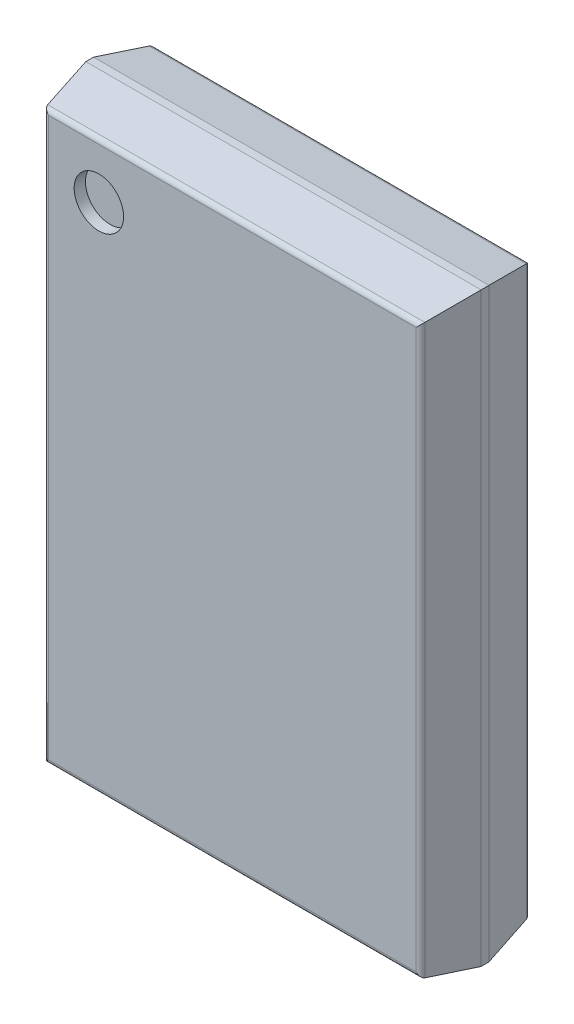
ISO-10303-21;
HEADER;
FILE_DESCRIPTION(('STEP AP214'),'2;1');
FILE_NAME('part.step','',(''),(''),'','','');
FILE_SCHEMA(('AUTOMOTIVE_DESIGN { 1 0 10303 214 1 1 1 1 }'));
ENDSEC;
DATA;
#1=APPLICATION_CONTEXT('core data for automotive mechanical design processes');
#2=APPLICATION_PROTOCOL_DEFINITION('international standard','automotive_design',2000,#1);
#3=PRODUCT_CONTEXT('',#1,'mechanical');
#4=PRODUCT('Part','Part','',(#3));
#5=PRODUCT_RELATED_PRODUCT_CATEGORY('part','',(#4));
#6=PRODUCT_DEFINITION_FORMATION('','',#4);
#7=PRODUCT_DEFINITION_CONTEXT('part definition',#1,'design');
#8=PRODUCT_DEFINITION('design','',#6,#7);
#9=PRODUCT_DEFINITION_SHAPE('','',#8);
#10=(LENGTH_UNIT() NAMED_UNIT(*) SI_UNIT(.MILLI.,.METRE.));
#11=(NAMED_UNIT(*) PLANE_ANGLE_UNIT() SI_UNIT($,.RADIAN.));
#12=(NAMED_UNIT(*) SI_UNIT($,.STERADIAN.) SOLID_ANGLE_UNIT());
#13=UNCERTAINTY_MEASURE_WITH_UNIT(LENGTH_MEASURE(1.E-05),#10,'distance_accuracy_value','');
#14=(GEOMETRIC_REPRESENTATION_CONTEXT(3) GLOBAL_UNCERTAINTY_ASSIGNED_CONTEXT((#13)) GLOBAL_UNIT_ASSIGNED_CONTEXT((#10,
#11,#12)) REPRESENTATION_CONTEXT('',''));
#15=CARTESIAN_POINT('',(0.,0.,0.));
#16=DIRECTION('',(0.,0.,1.));
#17=DIRECTION('',(1.,0.,0.));
#18=AXIS2_PLACEMENT_3D('',#15,#16,#17);
#19=CARTESIAN_POINT('',(-1.89,3.24,1.44));
#20=DIRECTION('',(0.,0.,1.));
#21=DIRECTION('',(1.,0.,0.));
#22=AXIS2_PLACEMENT_3D('',#19,#20,#21);
#23=PLANE('',#22);
#24=CARTESIAN_POINT('',(-1.89,3.24,1.44));
#25=DIRECTION('',(0.,0.,1.));
#26=DIRECTION('',(1.,0.,0.));
#27=AXIS2_PLACEMENT_3D('',#24,#25,#26);
#28=CIRCLE('',#27,0.35);
#29=CARTESIAN_POINT('',(-1.54,3.24,1.44));
#30=VERTEX_POINT('',#29);
#31=EDGE_CURVE('E20',#30,#30,#28,.T.);
#32=ORIENTED_EDGE('',*,*,#31,.T.);
#33=EDGE_LOOP('',(#32));
#34=FACE_BOUND('',#33,.T.);
#35=ADVANCED_FACE('F17',(#34),#23,.T.);
#36=CARTESIAN_POINT('',(-1.89,3.24,1.44));
#37=DIRECTION('',(0.,0.,1.));
#38=DIRECTION('',(1.,0.,0.));
#39=AXIS2_PLACEMENT_3D('',#36,#37,#38);
#40=CYLINDRICAL_SURFACE('',#39,0.35);
#41=CARTESIAN_POINT('',(-1.89,3.24,1.6));
#42=DIRECTION('',(0.,0.,1.));
#43=DIRECTION('',(1.,0.,0.));
#44=AXIS2_PLACEMENT_3D('',#41,#42,#43);
#45=CIRCLE('',#44,0.35);
#46=CARTESIAN_POINT('',(-1.54,3.24,1.6));
#47=VERTEX_POINT('',#46);
#48=EDGE_CURVE('E100',#47,#47,#45,.F.);
#49=ORIENTED_EDGE('',*,*,#48,.F.);
#50=EDGE_LOOP('',(#49));
#51=FACE_BOUND('',#50,.T.);
#52=ORIENTED_EDGE('',*,*,#31,.F.);
#53=EDGE_LOOP('',(#52));
#54=FACE_BOUND('',#53,.T.);
#55=ADVANCED_FACE('F117',(#51,#54),#40,.F.);
#56=CARTESIAN_POINT('',(-2.8,-4.15,1.6));
#57=DIRECTION('',(0.,0.,1.));
#58=DIRECTION('',(1.,0.,0.));
#59=AXIS2_PLACEMENT_3D('',#56,#57,#58);
#60=PLANE('',#59);
#61=ORIENTED_EDGE('',*,*,#48,.T.);
#62=EDGE_LOOP('',(#61));
#63=FACE_BOUND('',#62,.T.);
#64=DIRECTION('',(0.,1.,0.));
#65=VECTOR('',#64,1.);
#66=CARTESIAN_POINT('',(2.602227602736,-4.01,1.6));
#67=LINE('',#66,#65);
#68=CARTESIAN_POINT('',(2.602227602736,3.952227602736,1.6));
#69=VERTEX_POINT('',#68);
#70=CARTESIAN_POINT('',(2.602227602736,-3.952227602736,1.6));
#71=VERTEX_POINT('',#70);
#72=EDGE_CURVE('E107',#69,#71,#67,.F.);
#73=ORIENTED_EDGE('',*,*,#72,.F.);
#74=DIRECTION('',(1.,0.,0.));
#75=VECTOR('',#74,1.);
#76=CARTESIAN_POINT('',(-2.66,3.952227602736,1.6));
#77=LINE('',#76,#75);
#78=CARTESIAN_POINT('',(-2.602227602736,3.952227602736,1.6));
#79=VERTEX_POINT('',#78);
#80=EDGE_CURVE('E96',#79,#69,#77,.T.);
#81=ORIENTED_EDGE('',*,*,#80,.F.);
#82=DIRECTION('',(0.,1.,0.));
#83=VECTOR('',#82,1.);
#84=CARTESIAN_POINT('',(-2.602227602736,-4.01,1.6));
#85=LINE('',#84,#83);
#86=CARTESIAN_POINT('',(-2.602227602736,-3.952227602736,1.6));
#87=VERTEX_POINT('',#86);
#88=EDGE_CURVE('E92',#87,#79,#85,.T.);
#89=ORIENTED_EDGE('',*,*,#88,.F.);
#90=DIRECTION('',(1.,0.,0.));
#91=VECTOR('',#90,1.);
#92=CARTESIAN_POINT('',(-2.66,-3.952227602736,1.6));
#93=LINE('',#92,#91);
#94=EDGE_CURVE('E81',#71,#87,#93,.F.);
#95=ORIENTED_EDGE('',*,*,#94,.F.);
#96=EDGE_LOOP('',(#73,#81,#89,#95));
#97=FACE_BOUND('',#96,.T.);
#98=ADVANCED_FACE('F95',(#63,#97),#60,.T.);
#99=CARTESIAN_POINT('',(-2.602227602736,-4.01,1.53));
#100=DIRECTION('',(0.,1.,0.));
#101=DIRECTION('',(0.,0.,1.));
#102=AXIS2_PLACEMENT_3D('',#99,#100,#101);
#103=CYLINDRICAL_SURFACE('',#102,0.07);
#104=CARTESIAN_POINT('',(-2.602227602736,3.952227602736,1.53));
#105=DIRECTION('',(0.707106781186547,0.707106781186547,0.));
#106=DIRECTION('',(0.707106781186547,-0.707106781186547,0.));
#107=AXIS2_PLACEMENT_3D('',#104,#105,#106);
#108=ELLIPSE('',#107,0.0989949493661166,0.07);
#109=CARTESIAN_POINT('',(-2.6709570948907,4.02095709489041,1.54327617822089));
#110=VERTEX_POINT('',#109);
#111=EDGE_CURVE('E363',#110,#79,#108,.T.);
#112=ORIENTED_EDGE('',*,*,#111,.F.);
#113=DIRECTION('',(0.,1.,0.));
#114=VECTOR('',#113,1.);
#115=CARTESIAN_POINT('',(-2.67095709489041,-4.15,1.54327617822089));
#116=LINE('',#115,#114);
#117=CARTESIAN_POINT('',(-2.6709570948907,-4.02095709489041,1.54327617822089));
#118=VERTEX_POINT('',#117);
#119=EDGE_CURVE('E104',#110,#118,#116,.F.);
#120=ORIENTED_EDGE('',*,*,#119,.T.);
#121=CARTESIAN_POINT('',(-2.602227602736,-3.952227602736,1.53));
#122=DIRECTION('',(0.707106781186547,-0.707106781186547,0.));
#123=DIRECTION('',(0.707106781186547,0.707106781186547,0.));
#124=AXIS2_PLACEMENT_3D('',#121,#122,#123);
#125=ELLIPSE('',#124,0.0989949493661166,0.07);
#126=EDGE_CURVE('E86',#87,#118,#125,.T.);
#127=ORIENTED_EDGE('',*,*,#126,.F.);
#128=ORIENTED_EDGE('',*,*,#88,.T.);
#129=EDGE_LOOP('',(#112,#120,#127,#128));
#130=FACE_BOUND('',#129,.T.);
#131=ADVANCED_FACE('F103',(#130),#103,.T.);
#132=CARTESIAN_POINT('',(-2.66,-3.952227602736,1.53));
#133=DIRECTION('',(1.,0.,0.));
#134=DIRECTION('',(0.,0.,-1.));
#135=AXIS2_PLACEMENT_3D('',#132,#133,#134);
#136=CYLINDRICAL_SURFACE('',#135,0.07);
#137=ORIENTED_EDGE('',*,*,#94,.T.);
#138=ORIENTED_EDGE('',*,*,#126,.T.);
#139=DIRECTION('',(1.,0.,0.));
#140=VECTOR('',#139,1.);
#141=CARTESIAN_POINT('',(-2.8,-4.02095709489041,1.54327617822089));
#142=LINE('',#141,#140);
#143=CARTESIAN_POINT('',(2.67095709489041,-4.0209570948907,1.54327617822089));
#144=VERTEX_POINT('',#143);
#145=EDGE_CURVE('E380',#118,#144,#142,.T.);
#146=ORIENTED_EDGE('',*,*,#145,.T.);
#147=CARTESIAN_POINT('',(2.602227602736,-3.952227602736,1.53));
#148=DIRECTION('',(0.707106781186547,0.707106781186547,0.));
#149=DIRECTION('',(-0.707106781186547,0.707106781186547,0.));
#150=AXIS2_PLACEMENT_3D('',#147,#148,#149);
#151=ELLIPSE('',#150,0.0989949493661166,0.07);
#152=EDGE_CURVE('E88',#71,#144,#151,.T.);
#153=ORIENTED_EDGE('',*,*,#152,.F.);
#154=EDGE_LOOP('',(#137,#138,#146,#153));
#155=FACE_BOUND('',#154,.T.);
#156=ADVANCED_FACE('F83',(#155),#136,.T.);
#157=CARTESIAN_POINT('',(2.602227602736,-4.01,1.53));
#158=DIRECTION('',(0.,1.,0.));
#159=DIRECTION('',(0.,0.,1.));
#160=AXIS2_PLACEMENT_3D('',#157,#158,#159);
#161=CYLINDRICAL_SURFACE('',#160,0.07);
#162=CARTESIAN_POINT('',(2.602227602736,3.952227602736,1.53));
#163=DIRECTION('',(0.707106781186547,-0.707106781186547,0.));
#164=DIRECTION('',(0.707106781186547,0.707106781186547,0.));
#165=AXIS2_PLACEMENT_3D('',#162,#163,#164);
#166=ELLIPSE('',#165,0.0989949493661166,0.07);
#167=CARTESIAN_POINT('',(2.6709570948907,4.02095709489041,1.54327617822089));
#168=VERTEX_POINT('',#167);
#169=EDGE_CURVE('E357',#69,#168,#166,.F.);
#170=ORIENTED_EDGE('',*,*,#169,.F.);
#171=ORIENTED_EDGE('',*,*,#72,.T.);
#172=ORIENTED_EDGE('',*,*,#152,.T.);
#173=DIRECTION('',(0.,1.,0.));
#174=VECTOR('',#173,1.);
#175=CARTESIAN_POINT('',(2.67095709489041,-4.15,1.54327617822089));
#176=LINE('',#175,#174);
#177=EDGE_CURVE('E359',#168,#144,#176,.F.);
#178=ORIENTED_EDGE('',*,*,#177,.F.);
#179=EDGE_LOOP('',(#170,#171,#172,#178));
#180=FACE_BOUND('',#179,.T.);
#181=ADVANCED_FACE('F200',(#180),#161,.T.);
#182=CARTESIAN_POINT('',(-2.66,3.952227602736,1.53));
#183=DIRECTION('',(1.,0.,0.));
#184=DIRECTION('',(0.,0.,-1.));
#185=AXIS2_PLACEMENT_3D('',#182,#183,#184);
#186=CYLINDRICAL_SURFACE('',#185,0.07);
#187=DIRECTION('',(1.,0.,0.));
#188=VECTOR('',#187,1.);
#189=CARTESIAN_POINT('',(-2.8,4.02095709489041,1.54327617822089));
#190=LINE('',#189,#188);
#191=EDGE_CURVE('E385',#110,#168,#190,.T.);
#192=ORIENTED_EDGE('',*,*,#191,.F.);
#193=ORIENTED_EDGE('',*,*,#111,.T.);
#194=ORIENTED_EDGE('',*,*,#80,.T.);
#195=ORIENTED_EDGE('',*,*,#169,.T.);
#196=EDGE_LOOP('',(#192,#193,#194,#195));
#197=FACE_BOUND('',#196,.T.);
#198=ADVANCED_FACE('F196',(#197),#186,.T.);
#199=CARTESIAN_POINT('',(-2.73,-4.15,1.237616762088));
#200=DIRECTION('',(0.981849887924297,0.,-0.189659688872057));
#201=DIRECTION('',(-0.189659688872057,0.,-0.981849887924297));
#202=AXIS2_PLACEMENT_3D('',#199,#200,#201);
#203=PLANE('',#202);
#204=DIRECTION('',(0.186337934448843,-0.186337934449625,0.964653486165051));
#205=VECTOR('',#204,1.);
#206=CARTESIAN_POINT('',(-2.8,4.14999999999995,0.87523352417699));
#207=LINE('',#206,#205);
#208=CARTESIAN_POINT('',(-2.8,4.14999999999999,0.875233524176998));
#209=VERTEX_POINT('',#208);
#210=EDGE_CURVE('E408',#209,#110,#207,.T.);
#211=ORIENTED_EDGE('',*,*,#210,.F.);
#212=DIRECTION('',(0.,1.,0.));
#213=VECTOR('',#212,1.);
#214=CARTESIAN_POINT('',(-2.8,-4.15,0.875233524177));
#215=LINE('',#214,#213);
#216=CARTESIAN_POINT('',(-2.8,-4.14999999999999,0.875233524176998));
#217=VERTEX_POINT('',#216);
#218=EDGE_CURVE('E426',#209,#217,#215,.F.);
#219=ORIENTED_EDGE('',*,*,#218,.T.);
#220=DIRECTION('',(0.186337934448843,0.186337934449625,0.964653486165051));
#221=VECTOR('',#220,1.);
#222=CARTESIAN_POINT('',(-2.8,-4.14999999999995,0.87523352417699));
#223=LINE('',#222,#221);
#224=EDGE_CURVE('E382',#217,#118,#223,.T.);
#225=ORIENTED_EDGE('',*,*,#224,.T.);
#226=ORIENTED_EDGE('',*,*,#119,.F.);
#227=EDGE_LOOP('',(#211,#219,#225,#226));
#228=FACE_BOUND('',#227,.T.);
#229=ADVANCED_FACE('F192',(#228),#203,.F.);
#230=CARTESIAN_POINT('',(-2.8,-4.08,1.237616762088));
#231=DIRECTION('',(0.,0.981849887924297,-0.189659688872057));
#232=DIRECTION('',(0.,0.189659688872057,0.981849887924297));
#233=AXIS2_PLACEMENT_3D('',#230,#231,#232);
#234=PLANE('',#233);
#235=DIRECTION('',(1.,0.,0.));
#236=VECTOR('',#235,1.);
#237=CARTESIAN_POINT('',(-2.8,-4.15,0.875233524177));
#238=LINE('',#237,#236);
#239=CARTESIAN_POINT('',(2.79999999999999,-4.15,0.875233524176998));
#240=VERTEX_POINT('',#239);
#241=EDGE_CURVE('E395',#217,#240,#238,.T.);
#242=ORIENTED_EDGE('',*,*,#241,.T.);
#243=DIRECTION('',(0.186337934449624,-0.186337934448843,-0.964653486165051));
#244=VECTOR('',#243,1.);
#245=CARTESIAN_POINT('',(2.67095709489041,-4.020957094891,1.54327617822089));
#246=LINE('',#245,#244);
#247=EDGE_CURVE('E386',#144,#240,#246,.T.);
#248=ORIENTED_EDGE('',*,*,#247,.F.);
#249=ORIENTED_EDGE('',*,*,#145,.F.);
#250=ORIENTED_EDGE('',*,*,#224,.F.);
#251=EDGE_LOOP('',(#242,#248,#249,#250));
#252=FACE_BOUND('',#251,.T.);
#253=ADVANCED_FACE('F188',(#252),#234,.F.);
#254=CARTESIAN_POINT('',(2.73,-4.15,1.237616762088));
#255=DIRECTION('',(0.981849887924297,0.,0.189659688872057));
#256=DIRECTION('',(0.189659688872057,0.,-0.981849887924297));
#257=AXIS2_PLACEMENT_3D('',#254,#255,#256);
#258=PLANE('',#257);
#259=DIRECTION('',(0.186337934448843,0.186337934449625,-0.964653486165051));
#260=VECTOR('',#259,1.);
#261=CARTESIAN_POINT('',(2.670957094891,4.02095709489041,1.54327617822089));
#262=LINE('',#261,#260);
#263=CARTESIAN_POINT('',(2.8,4.14999999999999,0.875233524176998));
#264=VERTEX_POINT('',#263);
#265=EDGE_CURVE('E388',#168,#264,#262,.T.);
#266=ORIENTED_EDGE('',*,*,#265,.F.);
#267=ORIENTED_EDGE('',*,*,#177,.T.);
#268=ORIENTED_EDGE('',*,*,#247,.T.);
#269=DIRECTION('',(0.,1.,0.));
#270=VECTOR('',#269,1.);
#271=CARTESIAN_POINT('',(2.8,-4.15,0.875233524177));
#272=LINE('',#271,#270);
#273=EDGE_CURVE('E411',#264,#240,#272,.F.);
#274=ORIENTED_EDGE('',*,*,#273,.F.);
#275=EDGE_LOOP('',(#266,#267,#268,#274));
#276=FACE_BOUND('',#275,.T.);
#277=ADVANCED_FACE('F184',(#276),#258,.T.);
#278=CARTESIAN_POINT('',(-2.8,4.08,1.237616762088));
#279=DIRECTION('',(0.,0.981849887924297,0.189659688872057));
#280=DIRECTION('',(0.,-0.189659688872057,0.981849887924297));
#281=AXIS2_PLACEMENT_3D('',#278,#279,#280);
#282=PLANE('',#281);
#283=DIRECTION('',(1.,0.,0.));
#284=VECTOR('',#283,1.);
#285=CARTESIAN_POINT('',(-2.8,4.15,0.875233524177));
#286=LINE('',#285,#284);
#287=EDGE_CURVE('E417',#209,#264,#286,.T.);
#288=ORIENTED_EDGE('',*,*,#287,.F.);
#289=ORIENTED_EDGE('',*,*,#210,.T.);
#290=ORIENTED_EDGE('',*,*,#191,.T.);
#291=ORIENTED_EDGE('',*,*,#265,.T.);
#292=EDGE_LOOP('',(#288,#289,#290,#291));
#293=FACE_BOUND('',#292,.T.);
#294=ADVANCED_FACE('F180',(#293),#282,.T.);
#295=CARTESIAN_POINT('',(-2.8,-4.15,0.05));
#296=DIRECTION('',(1.,0.,0.));
#297=DIRECTION('',(0.,0.,-1.));
#298=AXIS2_PLACEMENT_3D('',#295,#296,#297);
#299=PLANE('',#298);
#300=DIRECTION('',(0.,0.,1.));
#301=VECTOR('',#300,1.);
#302=CARTESIAN_POINT('',(-2.8,4.15,0.05));
#303=LINE('',#302,#301);
#304=CARTESIAN_POINT('',(-2.79999999999999,4.14999999999998,0.765233524177004));
#305=VERTEX_POINT('',#304);
#306=EDGE_CURVE('E421',#305,#209,#303,.T.);
#307=ORIENTED_EDGE('',*,*,#306,.F.);
#308=DIRECTION('',(0.,1.,0.));
#309=VECTOR('',#308,1.);
#310=CARTESIAN_POINT('',(-2.79999999999997,-4.15,0.765233524177005));
#311=LINE('',#310,#309);
#312=CARTESIAN_POINT('',(-2.79999999999999,-4.14999999999999,0.765233524177004));
#313=VERTEX_POINT('',#312);
#314=EDGE_CURVE('E420',#313,#305,#311,.T.);
#315=ORIENTED_EDGE('',*,*,#314,.F.);
#316=DIRECTION('',(0.,0.,1.));
#317=VECTOR('',#316,1.);
#318=CARTESIAN_POINT('',(-2.8,-4.15,0.05));
#319=LINE('',#318,#317);
#320=EDGE_CURVE('E399',#313,#217,#319,.T.);
#321=ORIENTED_EDGE('',*,*,#320,.T.);
#322=ORIENTED_EDGE('',*,*,#218,.F.);
#323=EDGE_LOOP('',(#307,#315,#321,#322));
#324=FACE_BOUND('',#323,.T.);
#325=ADVANCED_FACE('F176',(#324),#299,.F.);
#326=CARTESIAN_POINT('',(-2.8,-4.15,0.05));
#327=DIRECTION('',(0.,1.,0.));
#328=DIRECTION('',(0.,0.,1.));
#329=AXIS2_PLACEMENT_3D('',#326,#327,#328);
#330=PLANE('',#329);
#331=ORIENTED_EDGE('',*,*,#320,.F.);
#332=DIRECTION('',(1.,0.,0.));
#333=VECTOR('',#332,1.);
#334=CARTESIAN_POINT('',(-2.8,-4.14999999999997,0.765233524177005));
#335=LINE('',#334,#333);
#336=CARTESIAN_POINT('',(2.79999999999999,-4.14999999999999,0.765233524177005));
#337=VERTEX_POINT('',#336);
#338=EDGE_CURVE('E437',#337,#313,#335,.F.);
#339=ORIENTED_EDGE('',*,*,#338,.F.);
#340=DIRECTION('',(0.,0.,-1.));
#341=VECTOR('',#340,1.);
#342=CARTESIAN_POINT('',(2.8,-4.15,0.05));
#343=LINE('',#342,#341);
#344=EDGE_CURVE('E398',#240,#337,#343,.T.);
#345=ORIENTED_EDGE('',*,*,#344,.F.);
#346=ORIENTED_EDGE('',*,*,#241,.F.);
#347=EDGE_LOOP('',(#331,#339,#345,#346));
#348=FACE_BOUND('',#347,.T.);
#349=ADVANCED_FACE('F172',(#348),#330,.F.);
#350=CARTESIAN_POINT('',(2.8,-4.15,0.05));
#351=DIRECTION('',(1.,0.,0.));
#352=DIRECTION('',(0.,0.,-1.));
#353=AXIS2_PLACEMENT_3D('',#350,#351,#352);
#354=PLANE('',#353);
#355=DIRECTION('',(0.,0.,1.));
#356=VECTOR('',#355,1.);
#357=CARTESIAN_POINT('',(2.8,4.15,0.05));
#358=LINE('',#357,#356);
#359=CARTESIAN_POINT('',(2.79999999999999,4.14999999999999,0.765233524177005));
#360=VERTEX_POINT('',#359);
#361=EDGE_CURVE('E414',#264,#360,#358,.F.);
#362=ORIENTED_EDGE('',*,*,#361,.F.);
#363=ORIENTED_EDGE('',*,*,#273,.T.);
#364=ORIENTED_EDGE('',*,*,#344,.T.);
#365=DIRECTION('',(0.,1.,0.));
#366=VECTOR('',#365,1.);
#367=CARTESIAN_POINT('',(2.79999999999997,-4.15,0.765233524177005));
#368=LINE('',#367,#366);
#369=EDGE_CURVE('E447',#337,#360,#368,.T.);
#370=ORIENTED_EDGE('',*,*,#369,.T.);
#371=EDGE_LOOP('',(#362,#363,#364,#370));
#372=FACE_BOUND('',#371,.T.);
#373=ADVANCED_FACE('F168',(#372),#354,.T.);
#374=CARTESIAN_POINT('',(-2.8,4.15,0.05));
#375=DIRECTION('',(0.,1.,0.));
#376=DIRECTION('',(0.,0.,1.));
#377=AXIS2_PLACEMENT_3D('',#374,#375,#376);
#378=PLANE('',#377);
#379=ORIENTED_EDGE('',*,*,#306,.T.);
#380=ORIENTED_EDGE('',*,*,#287,.T.);
#381=ORIENTED_EDGE('',*,*,#361,.T.);
#382=DIRECTION('',(1.,0.,0.));
#383=VECTOR('',#382,1.);
#384=CARTESIAN_POINT('',(-2.8,4.14999999999997,0.765233524177005));
#385=LINE('',#384,#383);
#386=EDGE_CURVE('E462',#360,#305,#385,.F.);
#387=ORIENTED_EDGE('',*,*,#386,.T.);
#388=EDGE_LOOP('',(#379,#380,#381,#387));
#389=FACE_BOUND('',#388,.T.);
#390=ADVANCED_FACE('F164',(#389),#378,.T.);
#391=CARTESIAN_POINT('',(-2.73,-4.15,0.407616762088));
#392=DIRECTION('',(-0.981376360585275,0.,-0.192094869490054));
#393=DIRECTION('',(-0.192094869490054,0.,0.981376360585275));
#394=AXIS2_PLACEMENT_3D('',#391,#392,#393);
#395=PLANE('',#394);
#396=DIRECTION('',(0.188645841744762,-0.188645841744763,-0.963755930090612));
#397=VECTOR('',#396,1.);
#398=CARTESIAN_POINT('',(-2.8,4.14999999999997,0.765233524177005));
#399=LINE('',#398,#397);
#400=CARTESIAN_POINT('',(-2.671069769539,4.021069769539,0.106553359135845));
#401=VERTEX_POINT('',#400);
#402=EDGE_CURVE('E465',#305,#401,#399,.T.);
#403=ORIENTED_EDGE('',*,*,#402,.T.);
#404=DIRECTION('',(0.,1.,0.));
#405=VECTOR('',#404,1.);
#406=CARTESIAN_POINT('',(-2.67106976953903,-4.01,0.106553359135995));
#407=LINE('',#406,#405);
#408=CARTESIAN_POINT('',(-2.671069769539,-4.021069769539,0.106553359135846));
#409=VERTEX_POINT('',#408);
#410=EDGE_CURVE('E370',#409,#401,#407,.T.);
#411=ORIENTED_EDGE('',*,*,#410,.F.);
#412=DIRECTION('',(0.188645841744762,0.188645841744763,-0.963755930090612));
#413=VECTOR('',#412,1.);
#414=CARTESIAN_POINT('',(-2.8,-4.14999999999997,0.765233524177005));
#415=LINE('',#414,#413);
#416=EDGE_CURVE('E440',#313,#409,#415,.T.);
#417=ORIENTED_EDGE('',*,*,#416,.F.);
#418=ORIENTED_EDGE('',*,*,#314,.T.);
#419=EDGE_LOOP('',(#403,#411,#417,#418));
#420=FACE_BOUND('',#419,.T.);
#421=ADVANCED_FACE('F160',(#420),#395,.T.);
#422=CARTESIAN_POINT('',(-2.8,-4.08,0.407616762088));
#423=DIRECTION('',(0.,-0.981376360585275,-0.192094869490054));
#424=DIRECTION('',(0.,0.192094869490054,-0.981376360585275));
#425=AXIS2_PLACEMENT_3D('',#422,#423,#424);
#426=PLANE('',#425);
#427=ORIENTED_EDGE('',*,*,#338,.T.);
#428=ORIENTED_EDGE('',*,*,#416,.T.);
#429=DIRECTION('',(1.,0.,0.));
#430=VECTOR('',#429,1.);
#431=CARTESIAN_POINT('',(-2.66,-4.02106976953903,0.106553359135995));
#432=LINE('',#431,#430);
#433=CARTESIAN_POINT('',(2.671069769539,-4.021069769539,0.106553359135846));
#434=VERTEX_POINT('',#433);
#435=EDGE_CURVE('E369',#434,#409,#432,.F.);
#436=ORIENTED_EDGE('',*,*,#435,.F.);
#437=DIRECTION('',(0.188645841744763,-0.188645841744761,0.963755930090612));
#438=VECTOR('',#437,1.);
#439=CARTESIAN_POINT('',(2.67106976953897,-4.021069769539,0.106553359136005));
#440=LINE('',#439,#438);
#441=EDGE_CURVE('E451',#434,#337,#440,.T.);
#442=ORIENTED_EDGE('',*,*,#441,.T.);
#443=EDGE_LOOP('',(#427,#428,#436,#442));
#444=FACE_BOUND('',#443,.T.);
#445=ADVANCED_FACE('F156',(#444),#426,.T.);
#446=CARTESIAN_POINT('',(2.73,-4.15,0.407616762088));
#447=DIRECTION('',(-0.981376360585275,0.,0.192094869490054));
#448=DIRECTION('',(0.192094869490054,0.,0.981376360585275));
#449=AXIS2_PLACEMENT_3D('',#446,#447,#448);
#450=PLANE('',#449);
#451=DIRECTION('',(0.188645841744761,0.188645841744763,0.963755930090612));
#452=VECTOR('',#451,1.);
#453=CARTESIAN_POINT('',(2.671069769539,4.02106976953897,0.106553359136006));
#454=LINE('',#453,#452);
#455=CARTESIAN_POINT('',(2.671069769539,4.021069769539,0.106553359135846));
#456=VERTEX_POINT('',#455);
#457=EDGE_CURVE('E450',#456,#360,#454,.T.);
#458=ORIENTED_EDGE('',*,*,#457,.T.);
#459=ORIENTED_EDGE('',*,*,#369,.F.);
#460=ORIENTED_EDGE('',*,*,#441,.F.);
#461=DIRECTION('',(0.,1.,0.));
#462=VECTOR('',#461,1.);
#463=CARTESIAN_POINT('',(2.67106976953903,-4.01,0.106553359135995));
#464=LINE('',#463,#462);
#465=EDGE_CURVE('E374',#456,#434,#464,.F.);
#466=ORIENTED_EDGE('',*,*,#465,.F.);
#467=EDGE_LOOP('',(#458,#459,#460,#466));
#468=FACE_BOUND('',#467,.T.);
#469=ADVANCED_FACE('F152',(#468),#450,.F.);
#470=CARTESIAN_POINT('',(-2.8,4.08,0.407616762088));
#471=DIRECTION('',(0.,-0.981376360585275,0.192094869490054));
#472=DIRECTION('',(0.,-0.192094869490054,-0.981376360585275));
#473=AXIS2_PLACEMENT_3D('',#470,#471,#472);
#474=PLANE('',#473);
#475=ORIENTED_EDGE('',*,*,#386,.F.);
#476=ORIENTED_EDGE('',*,*,#457,.F.);
#477=DIRECTION('',(1.,0.,0.));
#478=VECTOR('',#477,1.);
#479=CARTESIAN_POINT('',(-2.66,4.02106976953903,0.106553359135995));
#480=LINE('',#479,#478);
#481=EDGE_CURVE('E377',#401,#456,#480,.T.);
#482=ORIENTED_EDGE('',*,*,#481,.F.);
#483=ORIENTED_EDGE('',*,*,#402,.F.);
#484=EDGE_LOOP('',(#475,#476,#482,#483));
#485=FACE_BOUND('',#484,.T.);
#486=ADVANCED_FACE('F148',(#485),#474,.F.);
#487=CARTESIAN_POINT('',(-2.602373424298,-4.01,0.12));
#488=DIRECTION('',(0.,1.,0.));
#489=DIRECTION('',(0.,0.,1.));
#490=AXIS2_PLACEMENT_3D('',#487,#488,#489);
#491=CYLINDRICAL_SURFACE('',#490,0.07);
#492=DIRECTION('',(0.,1.,0.));
#493=VECTOR('',#492,1.);
#494=CARTESIAN_POINT('',(-2.602373424298,-4.15,0.05));
#495=LINE('',#494,#493);
#496=CARTESIAN_POINT('',(-2.602373424298,3.952373424298,0.05));
#497=VERTEX_POINT('',#496);
#498=CARTESIAN_POINT('',(-2.602373424298,-3.952373424298,0.05));
#499=VERTEX_POINT('',#498);
#500=EDGE_CURVE('E378',#497,#499,#495,.F.);
#501=ORIENTED_EDGE('',*,*,#500,.T.);
#502=CARTESIAN_POINT('',(-2.602373424298,-3.952373424298,0.12));
#503=DIRECTION('',(0.707106781186547,-0.707106781186547,0.));
#504=DIRECTION('',(0.707106781186547,0.707106781186547,0.));
#505=AXIS2_PLACEMENT_3D('',#502,#503,#504);
#506=ELLIPSE('',#505,0.0989949493661166,0.07);
#507=EDGE_CURVE('E367',#409,#499,#506,.T.);
#508=ORIENTED_EDGE('',*,*,#507,.F.);
#509=ORIENTED_EDGE('',*,*,#410,.T.);
#510=CARTESIAN_POINT('',(-2.602373424298,3.952373424298,0.12));
#511=DIRECTION('',(0.707106781186547,0.707106781186547,0.));
#512=DIRECTION('',(0.707106781186547,-0.707106781186547,0.));
#513=AXIS2_PLACEMENT_3D('',#510,#511,#512);
#514=ELLIPSE('',#513,0.0989949493661166,0.07);
#515=EDGE_CURVE('E373',#497,#401,#514,.T.);
#516=ORIENTED_EDGE('',*,*,#515,.F.);
#517=EDGE_LOOP('',(#501,#508,#509,#516));
#518=FACE_BOUND('',#517,.T.);
#519=ADVANCED_FACE('F144',(#518),#491,.T.);
#520=CARTESIAN_POINT('',(-2.66,-3.952373424298,0.12));
#521=DIRECTION('',(1.,0.,0.));
#522=DIRECTION('',(0.,0.,-1.));
#523=AXIS2_PLACEMENT_3D('',#520,#521,#522);
#524=CYLINDRICAL_SURFACE('',#523,0.07);
#525=CARTESIAN_POINT('',(2.602373424298,-3.952373424298,0.12));
#526=DIRECTION('',(0.707106781186547,0.707106781186547,0.));
#527=DIRECTION('',(-0.707106781186547,0.707106781186547,0.));
#528=AXIS2_PLACEMENT_3D('',#525,#526,#527);
#529=ELLIPSE('',#528,0.0989949493661166,0.07);
#530=CARTESIAN_POINT('',(2.602373424298,-3.952373424298,0.05));
#531=VERTEX_POINT('',#530);
#532=EDGE_CURVE('E371',#434,#531,#529,.T.);
#533=ORIENTED_EDGE('',*,*,#532,.F.);
#534=ORIENTED_EDGE('',*,*,#435,.T.);
#535=ORIENTED_EDGE('',*,*,#507,.T.);
#536=DIRECTION('',(1.,0.,0.));
#537=VECTOR('',#536,1.);
#538=CARTESIAN_POINT('',(-2.8,-3.952373424298,0.05));
#539=LINE('',#538,#537);
#540=EDGE_CURVE('E488',#499,#531,#539,.T.);
#541=ORIENTED_EDGE('',*,*,#540,.T.);
#542=EDGE_LOOP('',(#533,#534,#535,#541));
#543=FACE_BOUND('',#542,.T.);
#544=ADVANCED_FACE('F140',(#543),#524,.T.);
#545=CARTESIAN_POINT('',(2.602373424298,-4.01,0.12));
#546=DIRECTION('',(0.,1.,0.));
#547=DIRECTION('',(0.,0.,1.));
#548=AXIS2_PLACEMENT_3D('',#545,#546,#547);
#549=CYLINDRICAL_SURFACE('',#548,0.07);
#550=ORIENTED_EDGE('',*,*,#465,.T.);
#551=ORIENTED_EDGE('',*,*,#532,.T.);
#552=DIRECTION('',(0.,1.,0.));
#553=VECTOR('',#552,1.);
#554=CARTESIAN_POINT('',(2.602373424298,-4.15,0.05));
#555=LINE('',#554,#553);
#556=CARTESIAN_POINT('',(2.602373424298,3.952373424298,0.05));
#557=VERTEX_POINT('',#556);
#558=EDGE_CURVE('E26',#531,#557,#555,.T.);
#559=ORIENTED_EDGE('',*,*,#558,.T.);
#560=CARTESIAN_POINT('',(2.602373424298,3.952373424298,0.12));
#561=DIRECTION('',(0.707106781186547,-0.707106781186547,0.));
#562=DIRECTION('',(0.707106781186547,0.707106781186547,0.));
#563=AXIS2_PLACEMENT_3D('',#560,#561,#562);
#564=ELLIPSE('',#563,0.0989949493661166,0.07);
#565=EDGE_CURVE('E34',#456,#557,#564,.F.);
#566=ORIENTED_EDGE('',*,*,#565,.F.);
#567=EDGE_LOOP('',(#550,#551,#559,#566));
#568=FACE_BOUND('',#567,.T.);
#569=ADVANCED_FACE('F134',(#568),#549,.T.);
#570=CARTESIAN_POINT('',(-2.66,3.952373424298,0.12));
#571=DIRECTION('',(1.,0.,0.));
#572=DIRECTION('',(0.,0.,-1.));
#573=AXIS2_PLACEMENT_3D('',#570,#571,#572);
#574=CYLINDRICAL_SURFACE('',#573,0.07);
#575=ORIENTED_EDGE('',*,*,#565,.T.);
#576=DIRECTION('',(1.,0.,0.));
#577=VECTOR('',#576,1.);
#578=CARTESIAN_POINT('',(-2.8,3.952373424298,0.05));
#579=LINE('',#578,#577);
#580=EDGE_CURVE('E11',#557,#497,#579,.F.);
#581=ORIENTED_EDGE('',*,*,#580,.T.);
#582=ORIENTED_EDGE('',*,*,#515,.T.);
#583=ORIENTED_EDGE('',*,*,#481,.T.);
#584=EDGE_LOOP('',(#575,#581,#582,#583));
#585=FACE_BOUND('',#584,.T.);
#586=ADVANCED_FACE('F128',(#585),#574,.T.);
#587=CARTESIAN_POINT('',(-2.8,-4.15,0.05));
#588=DIRECTION('',(0.,0.,1.));
#589=DIRECTION('',(1.,0.,0.));
#590=AXIS2_PLACEMENT_3D('',#587,#588,#589);
#591=PLANE('',#590);
#592=ORIENTED_EDGE('',*,*,#558,.F.);
#593=ORIENTED_EDGE('',*,*,#540,.F.);
#594=ORIENTED_EDGE('',*,*,#500,.F.);
#595=ORIENTED_EDGE('',*,*,#580,.F.);
#596=EDGE_LOOP('',(#592,#593,#594,#595));
#597=FACE_BOUND('',#596,.T.);
#598=ADVANCED_FACE('F126',(#597),#591,.F.);
#599=CLOSED_SHELL('',(#35,#55,#98,#131,#156,#181,#198,#229,#253,#277,#294,#325,#349,#373,#390,
#421,#445,#469,#486,#519,#544,#569,#586,#598));
#600=MANIFOLD_SOLID_BREP('B1',#599);
#601=ADVANCED_BREP_SHAPE_REPRESENTATION('',(#18,#600),#14);
#602=SHAPE_DEFINITION_REPRESENTATION(#9,#601);
ENDSEC;
END-ISO-10303-21;
